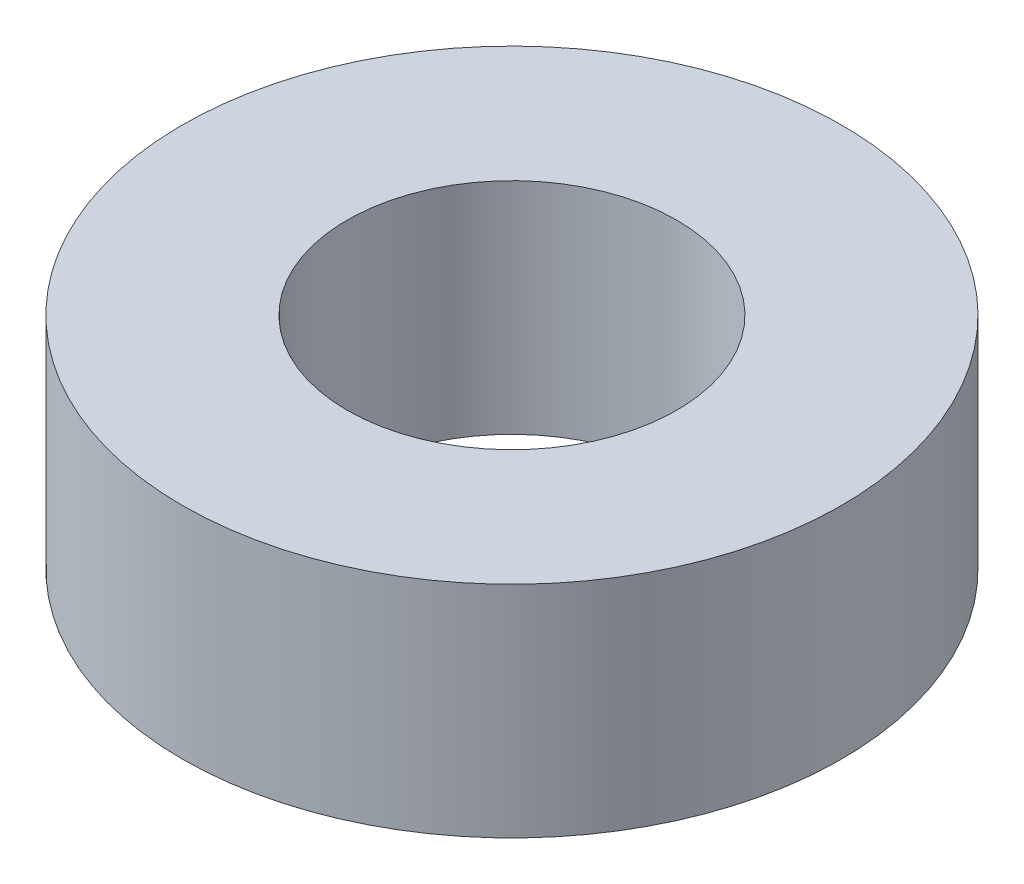
ISO-10303-21;
HEADER;
FILE_DESCRIPTION(('STEP AP214'),'2;1');
FILE_NAME('part.step','',(''),(''),'','','');
FILE_SCHEMA(('AUTOMOTIVE_DESIGN { 1 0 10303 214 1 1 1 1 }'));
ENDSEC;
DATA;
#1=APPLICATION_CONTEXT('core data for automotive mechanical design processes');
#2=APPLICATION_PROTOCOL_DEFINITION('international standard','automotive_design',2000,#1);
#3=PRODUCT_CONTEXT('',#1,'mechanical');
#4=PRODUCT('Part','Part','',(#3));
#5=PRODUCT_RELATED_PRODUCT_CATEGORY('part','',(#4));
#6=PRODUCT_DEFINITION_FORMATION('','',#4);
#7=PRODUCT_DEFINITION_CONTEXT('part definition',#1,'design');
#8=PRODUCT_DEFINITION('design','',#6,#7);
#9=PRODUCT_DEFINITION_SHAPE('','',#8);
#10=(LENGTH_UNIT() NAMED_UNIT(*) SI_UNIT(.MILLI.,.METRE.));
#11=(NAMED_UNIT(*) PLANE_ANGLE_UNIT() SI_UNIT($,.RADIAN.));
#12=(NAMED_UNIT(*) SI_UNIT($,.STERADIAN.) SOLID_ANGLE_UNIT());
#13=UNCERTAINTY_MEASURE_WITH_UNIT(LENGTH_MEASURE(1.E-05),#10,'distance_accuracy_value','');
#14=(GEOMETRIC_REPRESENTATION_CONTEXT(3) GLOBAL_UNCERTAINTY_ASSIGNED_CONTEXT((#13)) GLOBAL_UNIT_ASSIGNED_CONTEXT((#10,
#11,#12)) REPRESENTATION_CONTEXT('',''));
#15=CARTESIAN_POINT('',(0.,0.,0.));
#16=DIRECTION('',(0.,0.,1.));
#17=DIRECTION('',(1.,0.,0.));
#18=AXIS2_PLACEMENT_3D('',#15,#16,#17);
#19=CARTESIAN_POINT('',(-10.6643039845393,2.,-8.24059853350764));
#20=DIRECTION('',(0.,1.,0.));
#21=DIRECTION('',(0.,0.,1.));
#22=AXIS2_PLACEMENT_3D('',#19,#20,#21);
#23=PLANE('',#22);
#24=CARTESIAN_POINT('',(-10.6643039845393,2.,-8.24059853350764));
#25=DIRECTION('',(0.,1.,0.));
#26=DIRECTION('',(0.,0.,1.));
#27=AXIS2_PLACEMENT_3D('',#24,#25,#26);
#28=CIRCLE('',#27,3.);
#29=CARTESIAN_POINT('',(-10.6643039845393,2.,-5.24059853350764));
#30=VERTEX_POINT('',#29);
#31=EDGE_CURVE('E10',#30,#30,#28,.T.);
#32=ORIENTED_EDGE('',*,*,#31,.T.);
#33=EDGE_LOOP('',(#32));
#34=FACE_BOUND('',#33,.T.);
#35=CARTESIAN_POINT('',(-10.6643039845393,2.,-8.24059853350764));
#36=DIRECTION('',(0.,1.,0.));
#37=DIRECTION('',(0.,0.,1.));
#38=AXIS2_PLACEMENT_3D('',#35,#36,#37);
#39=CIRCLE('',#38,1.5);
#40=CARTESIAN_POINT('',(-10.6643039845393,2.,-6.74059853350764));
#41=VERTEX_POINT('',#40);
#42=EDGE_CURVE('E44',#41,#41,#39,.T.);
#43=ORIENTED_EDGE('',*,*,#42,.F.);
#44=EDGE_LOOP('',(#43));
#45=FACE_BOUND('',#44,.T.);
#46=ADVANCED_FACE('F33',(#34,#45),#23,.T.);
#47=CARTESIAN_POINT('',(-10.6643039845393,0.,-8.24059853350764));
#48=DIRECTION('',(0.,1.,0.));
#49=DIRECTION('',(0.,0.,1.));
#50=AXIS2_PLACEMENT_3D('',#47,#48,#49);
#51=PLANE('',#50);
#52=CARTESIAN_POINT('',(-10.6643039845393,0.,-8.24059853350764));
#53=DIRECTION('',(0.,1.,0.));
#54=DIRECTION('',(0.,0.,1.));
#55=AXIS2_PLACEMENT_3D('',#52,#53,#54);
#56=CIRCLE('',#55,3.);
#57=CARTESIAN_POINT('',(-10.6643039845393,0.,-5.24059853350764));
#58=VERTEX_POINT('',#57);
#59=EDGE_CURVE('E37',#58,#58,#56,.T.);
#60=ORIENTED_EDGE('',*,*,#59,.F.);
#61=EDGE_LOOP('',(#60));
#62=FACE_BOUND('',#61,.T.);
#63=CARTESIAN_POINT('',(-10.6643039845393,0.,-8.24059853350764));
#64=DIRECTION('',(0.,1.,0.));
#65=DIRECTION('',(0.,0.,1.));
#66=AXIS2_PLACEMENT_3D('',#63,#64,#65);
#67=CIRCLE('',#66,1.5);
#68=CARTESIAN_POINT('',(-10.6643039845393,0.,-6.74059853350764));
#69=VERTEX_POINT('',#68);
#70=EDGE_CURVE('E46',#69,#69,#67,.T.);
#71=ORIENTED_EDGE('',*,*,#70,.T.);
#72=EDGE_LOOP('',(#71));
#73=FACE_BOUND('',#72,.T.);
#74=ADVANCED_FACE('F56',(#62,#73),#51,.F.);
#75=CARTESIAN_POINT('',(-10.6643039845393,2.,-8.24059853350764));
#76=DIRECTION('',(0.,-1.,0.));
#77=DIRECTION('',(0.,0.,-1.));
#78=AXIS2_PLACEMENT_3D('',#75,#76,#77);
#79=CYLINDRICAL_SURFACE('',#78,3.);
#80=ORIENTED_EDGE('',*,*,#31,.F.);
#81=EDGE_LOOP('',(#80));
#82=FACE_BOUND('',#81,.T.);
#83=ORIENTED_EDGE('',*,*,#59,.T.);
#84=EDGE_LOOP('',(#83));
#85=FACE_BOUND('',#84,.T.);
#86=ADVANCED_FACE('F35',(#82,#85),#79,.T.);
#87=CARTESIAN_POINT('',(-10.6643039845393,2.,-8.24059853350764));
#88=DIRECTION('',(0.,-1.,0.));
#89=DIRECTION('',(0.,0.,-1.));
#90=AXIS2_PLACEMENT_3D('',#87,#88,#89);
#91=CYLINDRICAL_SURFACE('',#90,1.5);
#92=ORIENTED_EDGE('',*,*,#42,.T.);
#93=EDGE_LOOP('',(#92));
#94=FACE_BOUND('',#93,.T.);
#95=ORIENTED_EDGE('',*,*,#70,.F.);
#96=EDGE_LOOP('',(#95));
#97=FACE_BOUND('',#96,.T.);
#98=ADVANCED_FACE('F52',(#94,#97),#91,.F.);
#99=CLOSED_SHELL('',(#46,#74,#86,#98));
#100=MANIFOLD_SOLID_BREP('B2',#99);
#101=ADVANCED_BREP_SHAPE_REPRESENTATION('',(#18,#100),#14);
#102=SHAPE_DEFINITION_REPRESENTATION(#9,#101);
ENDSEC;
END-ISO-10303-21;
